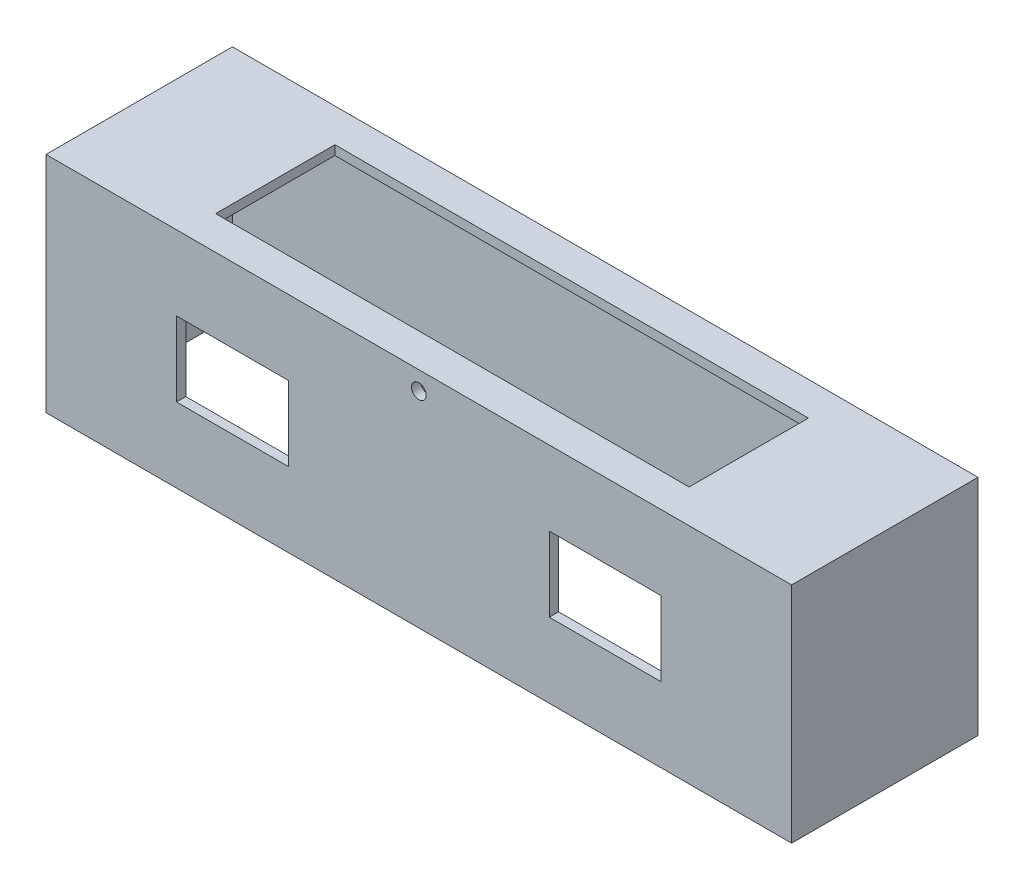
ISO-10303-21;
HEADER;
FILE_DESCRIPTION(('STEP AP214'),'2;1');
FILE_NAME('part.step','',(''),(''),'','','');
FILE_SCHEMA(('AUTOMOTIVE_DESIGN { 1 0 10303 214 1 1 1 1 }'));
ENDSEC;
DATA;
#1=APPLICATION_CONTEXT('core data for automotive mechanical design processes');
#2=APPLICATION_PROTOCOL_DEFINITION('international standard','automotive_design',2000,#1);
#3=PRODUCT_CONTEXT('',#1,'mechanical');
#4=PRODUCT('Part','Part','',(#3));
#5=PRODUCT_RELATED_PRODUCT_CATEGORY('part','',(#4));
#6=PRODUCT_DEFINITION_FORMATION('','',#4);
#7=PRODUCT_DEFINITION_CONTEXT('part definition',#1,'design');
#8=PRODUCT_DEFINITION('design','',#6,#7);
#9=PRODUCT_DEFINITION_SHAPE('','',#8);
#10=(LENGTH_UNIT() NAMED_UNIT(*) SI_UNIT(.MILLI.,.METRE.));
#11=(NAMED_UNIT(*) PLANE_ANGLE_UNIT() SI_UNIT($,.RADIAN.));
#12=(NAMED_UNIT(*) SI_UNIT($,.STERADIAN.) SOLID_ANGLE_UNIT());
#13=UNCERTAINTY_MEASURE_WITH_UNIT(LENGTH_MEASURE(1.E-05),#10,'distance_accuracy_value','');
#14=(GEOMETRIC_REPRESENTATION_CONTEXT(3) GLOBAL_UNCERTAINTY_ASSIGNED_CONTEXT((#13)) GLOBAL_UNIT_ASSIGNED_CONTEXT((#10,
#11,#12)) REPRESENTATION_CONTEXT('',''));
#15=CARTESIAN_POINT('',(0.,0.,0.));
#16=DIRECTION('',(0.,0.,1.));
#17=DIRECTION('',(1.,0.,0.));
#18=AXIS2_PLACEMENT_3D('',#15,#16,#17);
#19=CARTESIAN_POINT('',(-127.,76.2,-31.75));
#20=DIRECTION('',(0.,0.,-1.));
#21=DIRECTION('',(-1.,0.,0.));
#22=AXIS2_PLACEMENT_3D('',#19,#20,#21);
#23=PLANE('',#22);
#24=CARTESIAN_POINT('',(0.,69.85,-31.75));
#25=DIRECTION('',(0.,0.,-1.));
#26=DIRECTION('',(-1.,0.,0.));
#27=AXIS2_PLACEMENT_3D('',#24,#25,#26);
#28=CIRCLE('',#27,2.5);
#29=CARTESIAN_POINT('',(-2.5,69.85,-31.75));
#30=VERTEX_POINT('',#29);
#31=EDGE_CURVE('E200',#30,#30,#28,.T.);
#32=ORIENTED_EDGE('',*,*,#31,.F.);
#33=EDGE_LOOP('',(#32));
#34=FACE_BOUND('',#33,.T.);
#35=DIRECTION('',(1.,0.,0.));
#36=VECTOR('',#35,1.);
#37=CARTESIAN_POINT('',(-127.,0.,-31.75));
#38=LINE('',#37,#36);
#39=CARTESIAN_POINT('',(-127.,0.,-31.75));
#40=VERTEX_POINT('',#39);
#41=CARTESIAN_POINT('',(127.,0.,-31.75));
#42=VERTEX_POINT('',#41);
#43=EDGE_CURVE('E277',#40,#42,#38,.T.);
#44=ORIENTED_EDGE('',*,*,#43,.F.);
#45=DIRECTION('',(0.,-1.,0.));
#46=VECTOR('',#45,1.);
#47=CARTESIAN_POINT('',(-127.,76.2,-31.75));
#48=LINE('',#47,#46);
#49=CARTESIAN_POINT('',(-127.,76.2,-31.75));
#50=VERTEX_POINT('',#49);
#51=EDGE_CURVE('E327',#50,#40,#48,.T.);
#52=ORIENTED_EDGE('',*,*,#51,.F.);
#53=DIRECTION('',(1.,0.,0.));
#54=VECTOR('',#53,1.);
#55=CARTESIAN_POINT('',(-127.,76.2,-31.75));
#56=LINE('',#55,#54);
#57=CARTESIAN_POINT('',(127.,76.2,-31.75));
#58=VERTEX_POINT('',#57);
#59=EDGE_CURVE('E306',#50,#58,#56,.T.);
#60=ORIENTED_EDGE('',*,*,#59,.T.);
#61=DIRECTION('',(0.,-1.,0.));
#62=VECTOR('',#61,1.);
#63=CARTESIAN_POINT('',(127.,76.2,-31.75));
#64=LINE('',#63,#62);
#65=EDGE_CURVE('E317',#58,#42,#64,.T.);
#66=ORIENTED_EDGE('',*,*,#65,.T.);
#67=EDGE_LOOP('',(#44,#52,#60,#66));
#68=FACE_BOUND('',#67,.T.);
#69=ADVANCED_FACE('F39',(#34,#68),#23,.T.);
#70=CARTESIAN_POINT('',(-127.,76.2,-31.75));
#71=DIRECTION('',(1.,0.,0.));
#72=DIRECTION('',(0.,0.,-1.));
#73=AXIS2_PLACEMENT_3D('',#70,#71,#72);
#74=PLANE('',#73);
#75=DIRECTION('',(0.,0.,1.));
#76=VECTOR('',#75,1.);
#77=CARTESIAN_POINT('',(-127.,0.,-31.75));
#78=LINE('',#77,#76);
#79=CARTESIAN_POINT('',(-127.,0.,31.75));
#80=VERTEX_POINT('',#79);
#81=EDGE_CURVE('E310',#40,#80,#78,.T.);
#82=ORIENTED_EDGE('',*,*,#81,.T.);
#83=DIRECTION('',(0.,-1.,0.));
#84=VECTOR('',#83,1.);
#85=CARTESIAN_POINT('',(-127.,76.2,31.75));
#86=LINE('',#85,#84);
#87=CARTESIAN_POINT('',(-127.,76.2,31.75));
#88=VERTEX_POINT('',#87);
#89=EDGE_CURVE('E330',#88,#80,#86,.T.);
#90=ORIENTED_EDGE('',*,*,#89,.F.);
#91=DIRECTION('',(0.,0.,1.));
#92=VECTOR('',#91,1.);
#93=CARTESIAN_POINT('',(-127.,76.2,-31.75));
#94=LINE('',#93,#92);
#95=EDGE_CURVE('E315',#50,#88,#94,.T.);
#96=ORIENTED_EDGE('',*,*,#95,.F.);
#97=ORIENTED_EDGE('',*,*,#51,.T.);
#98=EDGE_LOOP('',(#82,#90,#96,#97));
#99=FACE_BOUND('',#98,.T.);
#100=ADVANCED_FACE('F361',(#99),#74,.F.);
#101=CARTESIAN_POINT('',(-127.,76.2,31.75));
#102=DIRECTION('',(0.,0.,-1.));
#103=DIRECTION('',(-1.,0.,0.));
#104=AXIS2_PLACEMENT_3D('',#101,#102,#103);
#105=PLANE('',#104);
#106=CARTESIAN_POINT('',(0.,69.85,31.75));
#107=DIRECTION('',(0.,0.,-1.));
#108=DIRECTION('',(-1.,0.,0.));
#109=AXIS2_PLACEMENT_3D('',#106,#107,#108);
#110=CIRCLE('',#109,2.5);
#111=CARTESIAN_POINT('',(-2.5,69.85,31.75));
#112=VERTEX_POINT('',#111);
#113=EDGE_CURVE('E203',#112,#112,#110,.T.);
#114=ORIENTED_EDGE('',*,*,#113,.T.);
#115=EDGE_LOOP('',(#114));
#116=FACE_BOUND('',#115,.T.);
#117=DIRECTION('',(0.,-1.,0.));
#118=VECTOR('',#117,1.);
#119=CARTESIAN_POINT('',(44.45,0.,31.75));
#120=LINE('',#119,#118);
#121=CARTESIAN_POINT('',(44.45,50.8,31.75));
#122=VERTEX_POINT('',#121);
#123=CARTESIAN_POINT('',(44.45,25.4,31.75));
#124=VERTEX_POINT('',#123);
#125=EDGE_CURVE('E217',#122,#124,#120,.T.);
#126=ORIENTED_EDGE('',*,*,#125,.F.);
#127=DIRECTION('',(-1.,0.,0.));
#128=VECTOR('',#127,1.);
#129=CARTESIAN_POINT('',(0.,50.8,31.75));
#130=LINE('',#129,#128);
#131=CARTESIAN_POINT('',(82.55,50.8,31.75));
#132=VERTEX_POINT('',#131);
#133=EDGE_CURVE('E225',#132,#122,#130,.T.);
#134=ORIENTED_EDGE('',*,*,#133,.F.);
#135=DIRECTION('',(0.,-1.,0.));
#136=VECTOR('',#135,1.);
#137=CARTESIAN_POINT('',(82.55,0.,31.75));
#138=LINE('',#137,#136);
#139=CARTESIAN_POINT('',(82.55,25.4,31.75));
#140=VERTEX_POINT('',#139);
#141=EDGE_CURVE('E229',#132,#140,#138,.T.);
#142=ORIENTED_EDGE('',*,*,#141,.T.);
#143=DIRECTION('',(-1.,0.,0.));
#144=VECTOR('',#143,1.);
#145=CARTESIAN_POINT('',(0.,25.4,31.75));
#146=LINE('',#145,#144);
#147=EDGE_CURVE('E218',#140,#124,#146,.T.);
#148=ORIENTED_EDGE('',*,*,#147,.T.);
#149=EDGE_LOOP('',(#126,#134,#142,#148));
#150=FACE_BOUND('',#149,.T.);
#151=DIRECTION('',(1.,0.,0.));
#152=VECTOR('',#151,1.);
#153=CARTESIAN_POINT('',(-82.55,25.4,31.75));
#154=LINE('',#153,#152);
#155=CARTESIAN_POINT('',(-82.55,25.4,31.75));
#156=VERTEX_POINT('',#155);
#157=CARTESIAN_POINT('',(-44.45,25.4,31.75));
#158=VERTEX_POINT('',#157);
#159=EDGE_CURVE('E268',#156,#158,#154,.T.);
#160=ORIENTED_EDGE('',*,*,#159,.F.);
#161=DIRECTION('',(0.,-1.,0.));
#162=VECTOR('',#161,1.);
#163=CARTESIAN_POINT('',(-82.55,50.8,31.75));
#164=LINE('',#163,#162);
#165=CARTESIAN_POINT('',(-82.55,50.8,31.75));
#166=VERTEX_POINT('',#165);
#167=EDGE_CURVE('E228',#166,#156,#164,.T.);
#168=ORIENTED_EDGE('',*,*,#167,.F.);
#169=DIRECTION('',(1.,0.,0.));
#170=VECTOR('',#169,1.);
#171=CARTESIAN_POINT('',(-82.55,50.8,31.75));
#172=LINE('',#171,#170);
#173=CARTESIAN_POINT('',(-44.45,50.8,31.75));
#174=VERTEX_POINT('',#173);
#175=EDGE_CURVE('E249',#166,#174,#172,.T.);
#176=ORIENTED_EDGE('',*,*,#175,.T.);
#177=DIRECTION('',(0.,-1.,0.));
#178=VECTOR('',#177,1.);
#179=CARTESIAN_POINT('',(-44.45,50.8,31.75));
#180=LINE('',#179,#178);
#181=EDGE_CURVE('E248',#174,#158,#180,.T.);
#182=ORIENTED_EDGE('',*,*,#181,.T.);
#183=EDGE_LOOP('',(#160,#168,#176,#182));
#184=FACE_BOUND('',#183,.T.);
#185=DIRECTION('',(1.,0.,0.));
#186=VECTOR('',#185,1.);
#187=CARTESIAN_POINT('',(-127.,0.,31.75));
#188=LINE('',#187,#186);
#189=CARTESIAN_POINT('',(127.,0.,31.75));
#190=VERTEX_POINT('',#189);
#191=EDGE_CURVE('E323',#80,#190,#188,.T.);
#192=ORIENTED_EDGE('',*,*,#191,.T.);
#193=DIRECTION('',(0.,-1.,0.));
#194=VECTOR('',#193,1.);
#195=CARTESIAN_POINT('',(127.,76.2,31.75));
#196=LINE('',#195,#194);
#197=CARTESIAN_POINT('',(127.,76.2,31.75));
#198=VERTEX_POINT('',#197);
#199=EDGE_CURVE('E333',#198,#190,#196,.T.);
#200=ORIENTED_EDGE('',*,*,#199,.F.);
#201=DIRECTION('',(1.,0.,0.));
#202=VECTOR('',#201,1.);
#203=CARTESIAN_POINT('',(-127.,76.2,31.75));
#204=LINE('',#203,#202);
#205=EDGE_CURVE('E313',#88,#198,#204,.T.);
#206=ORIENTED_EDGE('',*,*,#205,.F.);
#207=ORIENTED_EDGE('',*,*,#89,.T.);
#208=EDGE_LOOP('',(#192,#200,#206,#207));
#209=FACE_BOUND('',#208,.T.);
#210=ADVANCED_FACE('F366',(#116,#150,#184,#209),#105,.F.);
#211=CARTESIAN_POINT('',(127.,76.2,-31.75));
#212=DIRECTION('',(1.,0.,0.));
#213=DIRECTION('',(0.,0.,-1.));
#214=AXIS2_PLACEMENT_3D('',#211,#212,#213);
#215=PLANE('',#214);
#216=DIRECTION('',(0.,0.,1.));
#217=VECTOR('',#216,1.);
#218=CARTESIAN_POINT('',(127.,0.,-31.75));
#219=LINE('',#218,#217);
#220=EDGE_CURVE('E320',#42,#190,#219,.T.);
#221=ORIENTED_EDGE('',*,*,#220,.F.);
#222=ORIENTED_EDGE('',*,*,#65,.F.);
#223=DIRECTION('',(0.,0.,1.));
#224=VECTOR('',#223,1.);
#225=CARTESIAN_POINT('',(127.,76.2,-31.75));
#226=LINE('',#225,#224);
#227=EDGE_CURVE('E309',#58,#198,#226,.T.);
#228=ORIENTED_EDGE('',*,*,#227,.T.);
#229=ORIENTED_EDGE('',*,*,#199,.T.);
#230=EDGE_LOOP('',(#221,#222,#228,#229));
#231=FACE_BOUND('',#230,.T.);
#232=ADVANCED_FACE('F385',(#231),#215,.T.);
#233=CARTESIAN_POINT('',(0.,76.2,0.));
#234=DIRECTION('',(0.,-1.,0.));
#235=DIRECTION('',(0.,0.,-1.));
#236=AXIS2_PLACEMENT_3D('',#233,#234,#235);
#237=PLANE('',#236);
#238=DIRECTION('',(-1.,0.,0.));
#239=VECTOR('',#238,1.);
#240=CARTESIAN_POINT('',(-80.645,76.2,-20.32));
#241=LINE('',#240,#239);
#242=CARTESIAN_POINT('',(80.645,76.2,-20.32));
#243=VERTEX_POINT('',#242);
#244=CARTESIAN_POINT('',(-80.645,76.2,-20.32));
#245=VERTEX_POINT('',#244);
#246=EDGE_CURVE('E186',#243,#245,#241,.T.);
#247=ORIENTED_EDGE('',*,*,#246,.F.);
#248=DIRECTION('',(0.,0.,-1.));
#249=VECTOR('',#248,1.);
#250=CARTESIAN_POINT('',(80.645,76.2,-20.32));
#251=LINE('',#250,#249);
#252=CARTESIAN_POINT('',(80.645,76.2,20.32));
#253=VERTEX_POINT('',#252);
#254=EDGE_CURVE('E53',#253,#243,#251,.T.);
#255=ORIENTED_EDGE('',*,*,#254,.F.);
#256=DIRECTION('',(1.,0.,0.));
#257=VECTOR('',#256,1.);
#258=CARTESIAN_POINT('',(-80.645,76.2,20.32));
#259=LINE('',#258,#257);
#260=CARTESIAN_POINT('',(-80.645,76.2,20.32));
#261=VERTEX_POINT('',#260);
#262=EDGE_CURVE('E193',#261,#253,#259,.T.);
#263=ORIENTED_EDGE('',*,*,#262,.F.);
#264=DIRECTION('',(0.,0.,1.));
#265=VECTOR('',#264,1.);
#266=CARTESIAN_POINT('',(-80.645,76.2,-20.32));
#267=LINE('',#266,#265);
#268=EDGE_CURVE('E177',#245,#261,#267,.T.);
#269=ORIENTED_EDGE('',*,*,#268,.F.);
#270=EDGE_LOOP('',(#247,#255,#263,#269));
#271=FACE_BOUND('',#270,.T.);
#272=ORIENTED_EDGE('',*,*,#59,.F.);
#273=ORIENTED_EDGE('',*,*,#95,.T.);
#274=ORIENTED_EDGE('',*,*,#205,.T.);
#275=ORIENTED_EDGE('',*,*,#227,.F.);
#276=EDGE_LOOP('',(#272,#273,#274,#275));
#277=FACE_BOUND('',#276,.T.);
#278=ADVANCED_FACE('F190',(#271,#277),#237,.F.);
#279=CARTESIAN_POINT('',(0.,0.,0.));
#280=DIRECTION('',(0.,-1.,0.));
#281=DIRECTION('',(0.,0.,-1.));
#282=AXIS2_PLACEMENT_3D('',#279,#280,#281);
#283=PLANE('',#282);
#284=DIRECTION('',(1.,0.,0.));
#285=VECTOR('',#284,1.);
#286=CARTESIAN_POINT('',(0.,0.,-28.575));
#287=LINE('',#286,#285);
#288=CARTESIAN_POINT('',(-123.825,0.,-28.575));
#289=VERTEX_POINT('',#288);
#290=CARTESIAN_POINT('',(123.825,0.,-28.575));
#291=VERTEX_POINT('',#290);
#292=EDGE_CURVE('E236',#289,#291,#287,.T.);
#293=ORIENTED_EDGE('',*,*,#292,.F.);
#294=DIRECTION('',(0.,0.,1.));
#295=VECTOR('',#294,1.);
#296=CARTESIAN_POINT('',(-123.825,0.,0.));
#297=LINE('',#296,#295);
#298=CARTESIAN_POINT('',(-123.825,0.,28.575));
#299=VERTEX_POINT('',#298);
#300=EDGE_CURVE('E283',#289,#299,#297,.T.);
#301=ORIENTED_EDGE('',*,*,#300,.T.);
#302=DIRECTION('',(1.,0.,0.));
#303=VECTOR('',#302,1.);
#304=CARTESIAN_POINT('',(0.,0.,28.575));
#305=LINE('',#304,#303);
#306=CARTESIAN_POINT('',(123.825,0.,28.575));
#307=VERTEX_POINT('',#306);
#308=EDGE_CURVE('E301',#299,#307,#305,.T.);
#309=ORIENTED_EDGE('',*,*,#308,.T.);
#310=DIRECTION('',(0.,0.,1.));
#311=VECTOR('',#310,1.);
#312=CARTESIAN_POINT('',(123.825,0.,0.));
#313=LINE('',#312,#311);
#314=EDGE_CURVE('E298',#291,#307,#313,.T.);
#315=ORIENTED_EDGE('',*,*,#314,.F.);
#316=EDGE_LOOP('',(#293,#301,#309,#315));
#317=FACE_BOUND('',#316,.T.);
#318=ORIENTED_EDGE('',*,*,#43,.T.);
#319=ORIENTED_EDGE('',*,*,#220,.T.);
#320=ORIENTED_EDGE('',*,*,#191,.F.);
#321=ORIENTED_EDGE('',*,*,#81,.F.);
#322=EDGE_LOOP('',(#318,#319,#320,#321));
#323=FACE_BOUND('',#322,.T.);
#324=ADVANCED_FACE('F376',(#317,#323),#283,.T.);
#325=CARTESIAN_POINT('',(-127.,76.2,-28.575));
#326=DIRECTION('',(0.,0.,-1.));
#327=DIRECTION('',(-1.,0.,0.));
#328=AXIS2_PLACEMENT_3D('',#325,#326,#327);
#329=PLANE('',#328);
#330=CARTESIAN_POINT('',(0.,69.85,-28.575));
#331=DIRECTION('',(0.,0.,-1.));
#332=DIRECTION('',(-1.,0.,0.));
#333=AXIS2_PLACEMENT_3D('',#330,#331,#332);
#334=CIRCLE('',#333,2.5);
#335=CARTESIAN_POINT('',(-2.5,69.85,-28.575));
#336=VERTEX_POINT('',#335);
#337=EDGE_CURVE('E209',#336,#336,#334,.T.);
#338=ORIENTED_EDGE('',*,*,#337,.T.);
#339=EDGE_LOOP('',(#338));
#340=FACE_BOUND('',#339,.T.);
#341=ORIENTED_EDGE('',*,*,#292,.T.);
#342=DIRECTION('',(0.,-1.,0.));
#343=VECTOR('',#342,1.);
#344=CARTESIAN_POINT('',(123.825,76.2,-28.575));
#345=LINE('',#344,#343);
#346=CARTESIAN_POINT('',(123.825,73.025,-28.575));
#347=VERTEX_POINT('',#346);
#348=EDGE_CURVE('E284',#347,#291,#345,.T.);
#349=ORIENTED_EDGE('',*,*,#348,.F.);
#350=DIRECTION('',(1.,0.,0.));
#351=VECTOR('',#350,1.);
#352=CARTESIAN_POINT('',(0.,73.025,-28.575));
#353=LINE('',#352,#351);
#354=CARTESIAN_POINT('',(-123.825,73.025,-28.575));
#355=VERTEX_POINT('',#354);
#356=EDGE_CURVE('E279',#355,#347,#353,.T.);
#357=ORIENTED_EDGE('',*,*,#356,.F.);
#358=DIRECTION('',(0.,-1.,0.));
#359=VECTOR('',#358,1.);
#360=CARTESIAN_POINT('',(-123.825,76.2,-28.575));
#361=LINE('',#360,#359);
#362=EDGE_CURVE('E275',#355,#289,#361,.T.);
#363=ORIENTED_EDGE('',*,*,#362,.T.);
#364=EDGE_LOOP('',(#341,#349,#357,#363));
#365=FACE_BOUND('',#364,.T.);
#366=ADVANCED_FACE('F396',(#340,#365),#329,.F.);
#367=CARTESIAN_POINT('',(-123.825,76.2,-31.75));
#368=DIRECTION('',(1.,0.,0.));
#369=DIRECTION('',(0.,0.,-1.));
#370=AXIS2_PLACEMENT_3D('',#367,#368,#369);
#371=PLANE('',#370);
#372=ORIENTED_EDGE('',*,*,#300,.F.);
#373=ORIENTED_EDGE('',*,*,#362,.F.);
#374=DIRECTION('',(0.,0.,1.));
#375=VECTOR('',#374,1.);
#376=CARTESIAN_POINT('',(-123.825,73.025,0.));
#377=LINE('',#376,#375);
#378=CARTESIAN_POINT('',(-123.825,73.025,28.575));
#379=VERTEX_POINT('',#378);
#380=EDGE_CURVE('E287',#355,#379,#377,.T.);
#381=ORIENTED_EDGE('',*,*,#380,.T.);
#382=DIRECTION('',(0.,-1.,0.));
#383=VECTOR('',#382,1.);
#384=CARTESIAN_POINT('',(-123.825,76.2,28.575));
#385=LINE('',#384,#383);
#386=EDGE_CURVE('E278',#379,#299,#385,.T.);
#387=ORIENTED_EDGE('',*,*,#386,.T.);
#388=EDGE_LOOP('',(#372,#373,#381,#387));
#389=FACE_BOUND('',#388,.T.);
#390=ADVANCED_FACE('F409',(#389),#371,.T.);
#391=CARTESIAN_POINT('',(-127.,76.2,28.575));
#392=DIRECTION('',(0.,0.,-1.));
#393=DIRECTION('',(-1.,0.,0.));
#394=AXIS2_PLACEMENT_3D('',#391,#392,#393);
#395=PLANE('',#394);
#396=CARTESIAN_POINT('',(0.,69.85,28.575));
#397=DIRECTION('',(0.,0.,-1.));
#398=DIRECTION('',(-1.,0.,0.));
#399=AXIS2_PLACEMENT_3D('',#396,#397,#398);
#400=CIRCLE('',#399,2.5);
#401=CARTESIAN_POINT('',(-2.5,69.85,28.575));
#402=VERTEX_POINT('',#401);
#403=EDGE_CURVE('E206',#402,#402,#400,.T.);
#404=ORIENTED_EDGE('',*,*,#403,.F.);
#405=EDGE_LOOP('',(#404));
#406=FACE_BOUND('',#405,.T.);
#407=DIRECTION('',(-1.,0.,0.));
#408=VECTOR('',#407,1.);
#409=CARTESIAN_POINT('',(0.,50.8,28.575));
#410=LINE('',#409,#408);
#411=CARTESIAN_POINT('',(82.55,50.8,28.575));
#412=VERTEX_POINT('',#411);
#413=CARTESIAN_POINT('',(44.45,50.8,28.575));
#414=VERTEX_POINT('',#413);
#415=EDGE_CURVE('E213',#412,#414,#410,.T.);
#416=ORIENTED_EDGE('',*,*,#415,.T.);
#417=DIRECTION('',(0.,-1.,0.));
#418=VECTOR('',#417,1.);
#419=CARTESIAN_POINT('',(44.45,0.,28.575));
#420=LINE('',#419,#418);
#421=CARTESIAN_POINT('',(44.45,25.4,28.575));
#422=VERTEX_POINT('',#421);
#423=EDGE_CURVE('E237',#414,#422,#420,.T.);
#424=ORIENTED_EDGE('',*,*,#423,.T.);
#425=DIRECTION('',(-1.,0.,0.));
#426=VECTOR('',#425,1.);
#427=CARTESIAN_POINT('',(0.,25.4,28.575));
#428=LINE('',#427,#426);
#429=CARTESIAN_POINT('',(82.55,25.4,28.575));
#430=VERTEX_POINT('',#429);
#431=EDGE_CURVE('E234',#430,#422,#428,.T.);
#432=ORIENTED_EDGE('',*,*,#431,.F.);
#433=DIRECTION('',(0.,-1.,0.));
#434=VECTOR('',#433,1.);
#435=CARTESIAN_POINT('',(82.55,0.,28.575));
#436=LINE('',#435,#434);
#437=EDGE_CURVE('E232',#412,#430,#436,.T.);
#438=ORIENTED_EDGE('',*,*,#437,.F.);
#439=EDGE_LOOP('',(#416,#424,#432,#438));
#440=FACE_BOUND('',#439,.T.);
#441=DIRECTION('',(0.,-1.,0.));
#442=VECTOR('',#441,1.);
#443=CARTESIAN_POINT('',(-82.55,50.8,28.575));
#444=LINE('',#443,#442);
#445=CARTESIAN_POINT('',(-82.55,50.8,28.575));
#446=VERTEX_POINT('',#445);
#447=CARTESIAN_POINT('',(-82.55,25.4,28.575));
#448=VERTEX_POINT('',#447);
#449=EDGE_CURVE('E252',#446,#448,#444,.T.);
#450=ORIENTED_EDGE('',*,*,#449,.T.);
#451=DIRECTION('',(1.,0.,0.));
#452=VECTOR('',#451,1.);
#453=CARTESIAN_POINT('',(-82.55,25.4,28.575));
#454=LINE('',#453,#452);
#455=CARTESIAN_POINT('',(-44.45,25.4,28.575));
#456=VERTEX_POINT('',#455);
#457=EDGE_CURVE('E253',#448,#456,#454,.T.);
#458=ORIENTED_EDGE('',*,*,#457,.T.);
#459=DIRECTION('',(0.,-1.,0.));
#460=VECTOR('',#459,1.);
#461=CARTESIAN_POINT('',(-44.45,50.8,28.575));
#462=LINE('',#461,#460);
#463=CARTESIAN_POINT('',(-44.45,50.8,28.575));
#464=VERTEX_POINT('',#463);
#465=EDGE_CURVE('E212',#464,#456,#462,.T.);
#466=ORIENTED_EDGE('',*,*,#465,.F.);
#467=DIRECTION('',(1.,0.,0.));
#468=VECTOR('',#467,1.);
#469=CARTESIAN_POINT('',(-82.55,50.8,28.575));
#470=LINE('',#469,#468);
#471=EDGE_CURVE('E262',#446,#464,#470,.T.);
#472=ORIENTED_EDGE('',*,*,#471,.F.);
#473=EDGE_LOOP('',(#450,#458,#466,#472));
#474=FACE_BOUND('',#473,.T.);
#475=ORIENTED_EDGE('',*,*,#308,.F.);
#476=ORIENTED_EDGE('',*,*,#386,.F.);
#477=DIRECTION('',(1.,0.,0.));
#478=VECTOR('',#477,1.);
#479=CARTESIAN_POINT('',(0.,73.025,28.575));
#480=LINE('',#479,#478);
#481=CARTESIAN_POINT('',(123.825,73.025,28.575));
#482=VERTEX_POINT('',#481);
#483=EDGE_CURVE('E291',#379,#482,#480,.T.);
#484=ORIENTED_EDGE('',*,*,#483,.T.);
#485=DIRECTION('',(0.,-1.,0.));
#486=VECTOR('',#485,1.);
#487=CARTESIAN_POINT('',(123.825,76.2,28.575));
#488=LINE('',#487,#486);
#489=EDGE_CURVE('E286',#482,#307,#488,.T.);
#490=ORIENTED_EDGE('',*,*,#489,.T.);
#491=EDGE_LOOP('',(#475,#476,#484,#490));
#492=FACE_BOUND('',#491,.T.);
#493=ADVANCED_FACE('F405',(#406,#440,#474,#492),#395,.T.);
#494=CARTESIAN_POINT('',(123.825,76.2,-31.75));
#495=DIRECTION('',(1.,0.,0.));
#496=DIRECTION('',(0.,0.,-1.));
#497=AXIS2_PLACEMENT_3D('',#494,#495,#496);
#498=PLANE('',#497);
#499=ORIENTED_EDGE('',*,*,#314,.T.);
#500=ORIENTED_EDGE('',*,*,#489,.F.);
#501=DIRECTION('',(0.,0.,1.));
#502=VECTOR('',#501,1.);
#503=CARTESIAN_POINT('',(123.825,73.025,0.));
#504=LINE('',#503,#502);
#505=EDGE_CURVE('E282',#347,#482,#504,.T.);
#506=ORIENTED_EDGE('',*,*,#505,.F.);
#507=ORIENTED_EDGE('',*,*,#348,.T.);
#508=EDGE_LOOP('',(#499,#500,#506,#507));
#509=FACE_BOUND('',#508,.T.);
#510=ADVANCED_FACE('F402',(#509),#498,.F.);
#511=CARTESIAN_POINT('',(0.,73.025,0.));
#512=DIRECTION('',(0.,-1.,0.));
#513=DIRECTION('',(0.,0.,-1.));
#514=AXIS2_PLACEMENT_3D('',#511,#512,#513);
#515=PLANE('',#514);
#516=DIRECTION('',(0.,0.,1.));
#517=VECTOR('',#516,1.);
#518=CARTESIAN_POINT('',(80.645,73.025,0.));
#519=LINE('',#518,#517);
#520=CARTESIAN_POINT('',(80.645,73.025,-20.32));
#521=VERTEX_POINT('',#520);
#522=CARTESIAN_POINT('',(80.645,73.025,20.32));
#523=VERTEX_POINT('',#522);
#524=EDGE_CURVE('E11',#521,#523,#519,.T.);
#525=ORIENTED_EDGE('',*,*,#524,.F.);
#526=DIRECTION('',(1.,0.,0.));
#527=VECTOR('',#526,1.);
#528=CARTESIAN_POINT('',(0.,73.025,-20.32));
#529=LINE('',#528,#527);
#530=CARTESIAN_POINT('',(-80.645,73.025,-20.32));
#531=VERTEX_POINT('',#530);
#532=EDGE_CURVE('E329',#531,#521,#529,.T.);
#533=ORIENTED_EDGE('',*,*,#532,.F.);
#534=DIRECTION('',(0.,0.,-1.));
#535=VECTOR('',#534,1.);
#536=CARTESIAN_POINT('',(-80.645,73.025,0.));
#537=LINE('',#536,#535);
#538=CARTESIAN_POINT('',(-80.645,73.025,20.32));
#539=VERTEX_POINT('',#538);
#540=EDGE_CURVE('E180',#539,#531,#537,.T.);
#541=ORIENTED_EDGE('',*,*,#540,.F.);
#542=DIRECTION('',(-1.,0.,0.));
#543=VECTOR('',#542,1.);
#544=CARTESIAN_POINT('',(0.,73.025,20.32));
#545=LINE('',#544,#543);
#546=EDGE_CURVE('E46',#523,#539,#545,.T.);
#547=ORIENTED_EDGE('',*,*,#546,.F.);
#548=EDGE_LOOP('',(#525,#533,#541,#547));
#549=FACE_BOUND('',#548,.T.);
#550=ORIENTED_EDGE('',*,*,#356,.T.);
#551=ORIENTED_EDGE('',*,*,#505,.T.);
#552=ORIENTED_EDGE('',*,*,#483,.F.);
#553=ORIENTED_EDGE('',*,*,#380,.F.);
#554=EDGE_LOOP('',(#550,#551,#552,#553));
#555=FACE_BOUND('',#554,.T.);
#556=ADVANCED_FACE('F345',(#549,#555),#515,.T.);
#557=CARTESIAN_POINT('',(-82.55,50.8,-31.751));
#558=DIRECTION('',(-1.,0.,0.));
#559=DIRECTION('',(0.,0.,1.));
#560=AXIS2_PLACEMENT_3D('',#557,#558,#559);
#561=PLANE('',#560);
#562=DIRECTION('',(0.,0.,1.));
#563=VECTOR('',#562,1.);
#564=CARTESIAN_POINT('',(-82.55,50.8,-31.751));
#565=LINE('',#564,#563);
#566=EDGE_CURVE('E246',#446,#166,#565,.T.);
#567=ORIENTED_EDGE('',*,*,#566,.T.);
#568=ORIENTED_EDGE('',*,*,#167,.T.);
#569=DIRECTION('',(0.,0.,1.));
#570=VECTOR('',#569,1.);
#571=CARTESIAN_POINT('',(-82.55,25.4,-31.751));
#572=LINE('',#571,#570);
#573=EDGE_CURVE('E250',#448,#156,#572,.T.);
#574=ORIENTED_EDGE('',*,*,#573,.F.);
#575=ORIENTED_EDGE('',*,*,#449,.F.);
#576=EDGE_LOOP('',(#567,#568,#574,#575));
#577=FACE_BOUND('',#576,.T.);
#578=ADVANCED_FACE('F401',(#577),#561,.F.);
#579=CARTESIAN_POINT('',(-82.55,25.4,-31.751));
#580=DIRECTION('',(0.,-1.,0.));
#581=DIRECTION('',(0.,0.,-1.));
#582=AXIS2_PLACEMENT_3D('',#579,#580,#581);
#583=PLANE('',#582);
#584=ORIENTED_EDGE('',*,*,#573,.T.);
#585=ORIENTED_EDGE('',*,*,#159,.T.);
#586=DIRECTION('',(0.,0.,1.));
#587=VECTOR('',#586,1.);
#588=CARTESIAN_POINT('',(-44.45,25.4,-31.751));
#589=LINE('',#588,#587);
#590=EDGE_CURVE('E254',#456,#158,#589,.T.);
#591=ORIENTED_EDGE('',*,*,#590,.F.);
#592=ORIENTED_EDGE('',*,*,#457,.F.);
#593=EDGE_LOOP('',(#584,#585,#591,#592));
#594=FACE_BOUND('',#593,.T.);
#595=ADVANCED_FACE('F425',(#594),#583,.F.);
#596=CARTESIAN_POINT('',(-44.45,50.8,-31.751));
#597=DIRECTION('',(-1.,0.,0.));
#598=DIRECTION('',(0.,0.,1.));
#599=AXIS2_PLACEMENT_3D('',#596,#597,#598);
#600=PLANE('',#599);
#601=ORIENTED_EDGE('',*,*,#465,.T.);
#602=ORIENTED_EDGE('',*,*,#590,.T.);
#603=ORIENTED_EDGE('',*,*,#181,.F.);
#604=DIRECTION('',(0.,0.,1.));
#605=VECTOR('',#604,1.);
#606=CARTESIAN_POINT('',(-44.45,50.8,-31.751));
#607=LINE('',#606,#605);
#608=EDGE_CURVE('E256',#464,#174,#607,.T.);
#609=ORIENTED_EDGE('',*,*,#608,.F.);
#610=EDGE_LOOP('',(#601,#602,#603,#609));
#611=FACE_BOUND('',#610,.T.);
#612=ADVANCED_FACE('F421',(#611),#600,.T.);
#613=CARTESIAN_POINT('',(-82.55,50.8,-31.751));
#614=DIRECTION('',(0.,-1.,0.));
#615=DIRECTION('',(0.,0.,-1.));
#616=AXIS2_PLACEMENT_3D('',#613,#614,#615);
#617=PLANE('',#616);
#618=ORIENTED_EDGE('',*,*,#471,.T.);
#619=ORIENTED_EDGE('',*,*,#608,.T.);
#620=ORIENTED_EDGE('',*,*,#175,.F.);
#621=ORIENTED_EDGE('',*,*,#566,.F.);
#622=EDGE_LOOP('',(#618,#619,#620,#621));
#623=FACE_BOUND('',#622,.T.);
#624=ADVANCED_FACE('F417',(#623),#617,.T.);
#625=CARTESIAN_POINT('',(0.,50.8,-31.751));
#626=DIRECTION('',(0.,1.,0.));
#627=DIRECTION('',(0.,0.,1.));
#628=AXIS2_PLACEMENT_3D('',#625,#626,#627);
#629=PLANE('',#628);
#630=DIRECTION('',(0.,0.,1.));
#631=VECTOR('',#630,1.);
#632=CARTESIAN_POINT('',(82.55,50.8,-31.751));
#633=LINE('',#632,#631);
#634=EDGE_CURVE('E221',#412,#132,#633,.T.);
#635=ORIENTED_EDGE('',*,*,#634,.T.);
#636=ORIENTED_EDGE('',*,*,#133,.T.);
#637=DIRECTION('',(0.,0.,1.));
#638=VECTOR('',#637,1.);
#639=CARTESIAN_POINT('',(44.45,50.8,-31.751));
#640=LINE('',#639,#638);
#641=EDGE_CURVE('E216',#414,#122,#640,.T.);
#642=ORIENTED_EDGE('',*,*,#641,.F.);
#643=ORIENTED_EDGE('',*,*,#415,.F.);
#644=EDGE_LOOP('',(#635,#636,#642,#643));
#645=FACE_BOUND('',#644,.T.);
#646=ADVANCED_FACE('F420',(#645),#629,.F.);
#647=CARTESIAN_POINT('',(44.45,0.,-31.751));
#648=DIRECTION('',(-1.,0.,0.));
#649=DIRECTION('',(0.,0.,1.));
#650=AXIS2_PLACEMENT_3D('',#647,#648,#649);
#651=PLANE('',#650);
#652=ORIENTED_EDGE('',*,*,#641,.T.);
#653=ORIENTED_EDGE('',*,*,#125,.T.);
#654=DIRECTION('',(0.,0.,1.));
#655=VECTOR('',#654,1.);
#656=CARTESIAN_POINT('',(44.45,25.4,-31.751));
#657=LINE('',#656,#655);
#658=EDGE_CURVE('E240',#422,#124,#657,.T.);
#659=ORIENTED_EDGE('',*,*,#658,.F.);
#660=ORIENTED_EDGE('',*,*,#423,.F.);
#661=EDGE_LOOP('',(#652,#653,#659,#660));
#662=FACE_BOUND('',#661,.T.);
#663=ADVANCED_FACE('F435',(#662),#651,.F.);
#664=CARTESIAN_POINT('',(0.,25.4,-31.751));
#665=DIRECTION('',(0.,1.,0.));
#666=DIRECTION('',(0.,0.,1.));
#667=AXIS2_PLACEMENT_3D('',#664,#665,#666);
#668=PLANE('',#667);
#669=ORIENTED_EDGE('',*,*,#431,.T.);
#670=ORIENTED_EDGE('',*,*,#658,.T.);
#671=ORIENTED_EDGE('',*,*,#147,.F.);
#672=DIRECTION('',(0.,0.,1.));
#673=VECTOR('',#672,1.);
#674=CARTESIAN_POINT('',(82.55,25.4,-31.751));
#675=LINE('',#674,#673);
#676=EDGE_CURVE('E222',#430,#140,#675,.T.);
#677=ORIENTED_EDGE('',*,*,#676,.F.);
#678=EDGE_LOOP('',(#669,#670,#671,#677));
#679=FACE_BOUND('',#678,.T.);
#680=ADVANCED_FACE('F439',(#679),#668,.T.);
#681=CARTESIAN_POINT('',(82.55,0.,-31.751));
#682=DIRECTION('',(-1.,0.,0.));
#683=DIRECTION('',(0.,0.,1.));
#684=AXIS2_PLACEMENT_3D('',#681,#682,#683);
#685=PLANE('',#684);
#686=ORIENTED_EDGE('',*,*,#437,.T.);
#687=ORIENTED_EDGE('',*,*,#676,.T.);
#688=ORIENTED_EDGE('',*,*,#141,.F.);
#689=ORIENTED_EDGE('',*,*,#634,.F.);
#690=EDGE_LOOP('',(#686,#687,#688,#689));
#691=FACE_BOUND('',#690,.T.);
#692=ADVANCED_FACE('F443',(#691),#685,.T.);
#693=CARTESIAN_POINT('',(0.,69.85,31.75));
#694=DIRECTION('',(0.,0.,-1.));
#695=DIRECTION('',(-1.,0.,0.));
#696=AXIS2_PLACEMENT_3D('',#693,#694,#695);
#697=CYLINDRICAL_SURFACE('',#696,2.5);
#698=ORIENTED_EDGE('',*,*,#403,.T.);
#699=EDGE_LOOP('',(#698));
#700=FACE_BOUND('',#699,.T.);
#701=ORIENTED_EDGE('',*,*,#113,.F.);
#702=EDGE_LOOP('',(#701));
#703=FACE_BOUND('',#702,.T.);
#704=ADVANCED_FACE('F356',(#700,#703),#697,.F.);
#705=ORIENTED_EDGE('',*,*,#31,.T.);
#706=EDGE_LOOP('',(#705));
#707=FACE_BOUND('',#706,.T.);
#708=ORIENTED_EDGE('',*,*,#337,.F.);
#709=EDGE_LOOP('',(#708));
#710=FACE_BOUND('',#709,.T.);
#711=ADVANCED_FACE('F349',(#707,#710),#697,.F.);
#712=CARTESIAN_POINT('',(80.645,0.,-20.32));
#713=DIRECTION('',(1.,0.,0.));
#714=DIRECTION('',(0.,0.,-1.));
#715=AXIS2_PLACEMENT_3D('',#712,#713,#714);
#716=PLANE('',#715);
#717=ORIENTED_EDGE('',*,*,#524,.T.);
#718=DIRECTION('',(0.,1.,0.));
#719=VECTOR('',#718,1.);
#720=CARTESIAN_POINT('',(80.645,0.,20.32));
#721=LINE('',#720,#719);
#722=EDGE_CURVE('E198',#523,#253,#721,.T.);
#723=ORIENTED_EDGE('',*,*,#722,.T.);
#724=ORIENTED_EDGE('',*,*,#254,.T.);
#725=DIRECTION('',(0.,1.,0.));
#726=VECTOR('',#725,1.);
#727=CARTESIAN_POINT('',(80.645,0.,-20.32));
#728=LINE('',#727,#726);
#729=EDGE_CURVE('E183',#521,#243,#728,.T.);
#730=ORIENTED_EDGE('',*,*,#729,.F.);
#731=EDGE_LOOP('',(#717,#723,#724,#730));
#732=FACE_BOUND('',#731,.T.);
#733=ADVANCED_FACE('F347',(#732),#716,.F.);
#734=CARTESIAN_POINT('',(-80.645,0.,20.32));
#735=DIRECTION('',(0.,0.,1.));
#736=DIRECTION('',(1.,0.,0.));
#737=AXIS2_PLACEMENT_3D('',#734,#735,#736);
#738=PLANE('',#737);
#739=ORIENTED_EDGE('',*,*,#546,.T.);
#740=DIRECTION('',(0.,1.,0.));
#741=VECTOR('',#740,1.);
#742=CARTESIAN_POINT('',(-80.645,0.,20.32));
#743=LINE('',#742,#741);
#744=EDGE_CURVE('E182',#539,#261,#743,.T.);
#745=ORIENTED_EDGE('',*,*,#744,.T.);
#746=ORIENTED_EDGE('',*,*,#262,.T.);
#747=ORIENTED_EDGE('',*,*,#722,.F.);
#748=EDGE_LOOP('',(#739,#745,#746,#747));
#749=FACE_BOUND('',#748,.T.);
#750=ADVANCED_FACE('F342',(#749),#738,.F.);
#751=CARTESIAN_POINT('',(-80.645,0.,-20.32));
#752=DIRECTION('',(-1.,0.,0.));
#753=DIRECTION('',(0.,0.,1.));
#754=AXIS2_PLACEMENT_3D('',#751,#752,#753);
#755=PLANE('',#754);
#756=ORIENTED_EDGE('',*,*,#540,.T.);
#757=DIRECTION('',(0.,1.,0.));
#758=VECTOR('',#757,1.);
#759=CARTESIAN_POINT('',(-80.645,0.,-20.32));
#760=LINE('',#759,#758);
#761=EDGE_CURVE('E61',#531,#245,#760,.T.);
#762=ORIENTED_EDGE('',*,*,#761,.T.);
#763=ORIENTED_EDGE('',*,*,#268,.T.);
#764=ORIENTED_EDGE('',*,*,#744,.F.);
#765=EDGE_LOOP('',(#756,#762,#763,#764));
#766=FACE_BOUND('',#765,.T.);
#767=ADVANCED_FACE('F174',(#766),#755,.F.);
#768=CARTESIAN_POINT('',(-80.645,0.,-20.32));
#769=DIRECTION('',(0.,0.,-1.));
#770=DIRECTION('',(-1.,0.,0.));
#771=AXIS2_PLACEMENT_3D('',#768,#769,#770);
#772=PLANE('',#771);
#773=ORIENTED_EDGE('',*,*,#532,.T.);
#774=ORIENTED_EDGE('',*,*,#729,.T.);
#775=ORIENTED_EDGE('',*,*,#246,.T.);
#776=ORIENTED_EDGE('',*,*,#761,.F.);
#777=EDGE_LOOP('',(#773,#774,#775,#776));
#778=FACE_BOUND('',#777,.T.);
#779=ADVANCED_FACE('F187',(#778),#772,.F.);
#780=CLOSED_SHELL('',(#69,#100,#210,#232,#278,#324,#366,#390,#493,#510,#556,#578,#595,#612,#624,
#646,#663,#680,#692,#704,#711,#733,#750,#767,#779));
#781=MANIFOLD_SOLID_BREP('B2',#780);
#782=ADVANCED_BREP_SHAPE_REPRESENTATION('',(#18,#781),#14);
#783=SHAPE_DEFINITION_REPRESENTATION(#9,#782);
ENDSEC;
END-ISO-10303-21;
